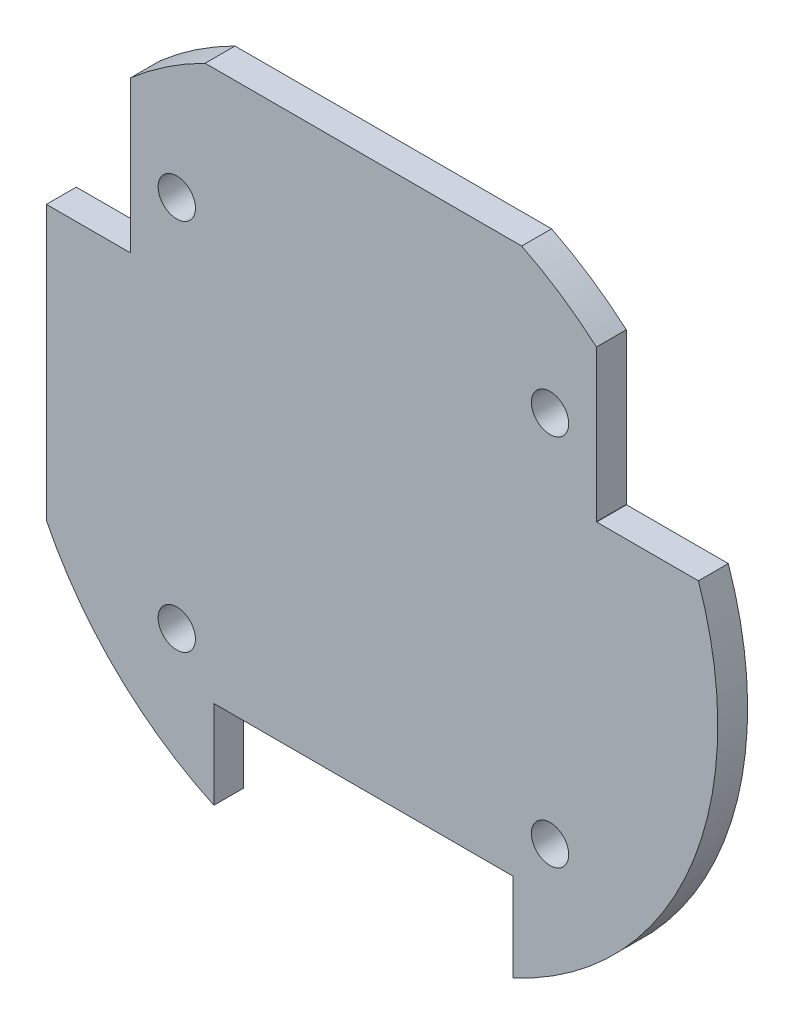
ISO-10303-21;
HEADER;
FILE_DESCRIPTION(('STEP AP214'),'2;1');
FILE_NAME('part.step','',(''),(''),'','','');
FILE_SCHEMA(('AUTOMOTIVE_DESIGN { 1 0 10303 214 1 1 1 1 }'));
ENDSEC;
DATA;
#1=APPLICATION_CONTEXT('core data for automotive mechanical design processes');
#2=APPLICATION_PROTOCOL_DEFINITION('international standard','automotive_design',2000,#1);
#3=PRODUCT_CONTEXT('',#1,'mechanical');
#4=PRODUCT('Part','Part','',(#3));
#5=PRODUCT_RELATED_PRODUCT_CATEGORY('part','',(#4));
#6=PRODUCT_DEFINITION_FORMATION('','',#4);
#7=PRODUCT_DEFINITION_CONTEXT('part definition',#1,'design');
#8=PRODUCT_DEFINITION('design','',#6,#7);
#9=PRODUCT_DEFINITION_SHAPE('','',#8);
#10=(LENGTH_UNIT() NAMED_UNIT(*) SI_UNIT(.MILLI.,.METRE.));
#11=(NAMED_UNIT(*) PLANE_ANGLE_UNIT() SI_UNIT($,.RADIAN.));
#12=(NAMED_UNIT(*) SI_UNIT($,.STERADIAN.) SOLID_ANGLE_UNIT());
#13=UNCERTAINTY_MEASURE_WITH_UNIT(LENGTH_MEASURE(1.E-05),#10,'distance_accuracy_value','');
#14=(GEOMETRIC_REPRESENTATION_CONTEXT(3) GLOBAL_UNCERTAINTY_ASSIGNED_CONTEXT((#13)) GLOBAL_UNIT_ASSIGNED_CONTEXT((#10,
#11,#12)) REPRESENTATION_CONTEXT('',''));
#15=CARTESIAN_POINT('',(0.,0.,0.));
#16=DIRECTION('',(0.,0.,1.));
#17=DIRECTION('',(1.,0.,0.));
#18=AXIS2_PLACEMENT_3D('',#15,#16,#17);
#19=CARTESIAN_POINT('',(4.48506477013,-0.05605791211582,0.));
#20=DIRECTION('',(0.,0.,-1.));
#21=DIRECTION('',(0.,-1.,0.));
#22=AXIS2_PLACEMENT_3D('',#19,#20,#21);
#23=CYLINDRICAL_SURFACE('',#22,0.01270002540005);
#24=DIRECTION('',(0.,0.,1.));
#25=VECTOR('',#24,1.);
#26=CARTESIAN_POINT('',(4.49776479553,-0.05605791211582,0.));
#27=LINE('',#26,#25);
#28=CARTESIAN_POINT('',(4.49776479553,-0.05605791211582,-1.51));
#29=VERTEX_POINT('',#28);
#30=CARTESIAN_POINT('',(4.49776479553,-0.05605791211582,0.09004318008636));
#31=VERTEX_POINT('',#30);
#32=EDGE_CURVE('E322',#29,#31,#27,.T.);
#33=ORIENTED_EDGE('',*,*,#32,.F.);
#34=CARTESIAN_POINT('',(4.48506477013,-0.05605791211582,-1.51));
#35=DIRECTION('',(0.,0.,1.));
#36=DIRECTION('',(0.,-1.,0.));
#37=AXIS2_PLACEMENT_3D('',#34,#35,#36);
#38=CIRCLE('',#37,0.01270002540005);
#39=CARTESIAN_POINT('',(4.48506477013,-0.06875793751587,-1.51));
#40=VERTEX_POINT('',#39);
#41=EDGE_CURVE('E231',#40,#29,#38,.T.);
#42=ORIENTED_EDGE('',*,*,#41,.F.);
#43=DIRECTION('',(0.,0.,1.));
#44=VECTOR('',#43,1.);
#45=CARTESIAN_POINT('',(4.48506477013,-0.06875793751587,0.));
#46=LINE('',#45,#44);
#47=CARTESIAN_POINT('',(4.48506477013,-0.06875793751587,0.09004318008636));
#48=VERTEX_POINT('',#47);
#49=EDGE_CURVE('E328',#40,#48,#46,.T.);
#50=ORIENTED_EDGE('',*,*,#49,.T.);
#51=CARTESIAN_POINT('',(4.48506477013,-0.05605791211582,0.09004318008636));
#52=DIRECTION('',(0.,0.,1.));
#53=DIRECTION('',(0.,-1.,0.));
#54=AXIS2_PLACEMENT_3D('',#51,#52,#53);
#55=CIRCLE('',#54,0.01270002540005);
#56=EDGE_CURVE('E324',#48,#31,#55,.T.);
#57=ORIENTED_EDGE('',*,*,#56,.T.);
#58=EDGE_LOOP('',(#33,#42,#50,#57));
#59=FACE_BOUND('',#58,.T.);
#60=ADVANCED_FACE('F62',(#59),#23,.F.);
#61=CARTESIAN_POINT('',(-0.002311404622809,-0.06875793751587,0.));
#62=DIRECTION('',(0.,1.,0.));
#63=DIRECTION('',(1.,0.,0.));
#64=AXIS2_PLACEMENT_3D('',#61,#62,#63);
#65=PLANE('',#64);
#66=ORIENTED_EDGE('',*,*,#49,.F.);
#67=DIRECTION('',(1.,0.,0.));
#68=VECTOR('',#67,1.);
#69=CARTESIAN_POINT('',(-0.002311404622809,-0.06875793751587,-1.51));
#70=LINE('',#69,#68);
#71=CARTESIAN_POINT('',(-0.002311404622809,-0.06875793751587,-1.51));
#72=VERTEX_POINT('',#71);
#73=EDGE_CURVE('E260',#72,#40,#70,.T.);
#74=ORIENTED_EDGE('',*,*,#73,.F.);
#75=DIRECTION('',(0.,0.,1.));
#76=VECTOR('',#75,1.);
#77=CARTESIAN_POINT('',(-0.002311404622809,-0.06875793751587,0.));
#78=LINE('',#77,#76);
#79=CARTESIAN_POINT('',(-0.002311404622809,-0.06875793751587,0.09004318008636));
#80=VERTEX_POINT('',#79);
#81=EDGE_CURVE('E333',#72,#80,#78,.T.);
#82=ORIENTED_EDGE('',*,*,#81,.T.);
#83=DIRECTION('',(1.,0.,0.));
#84=VECTOR('',#83,1.);
#85=CARTESIAN_POINT('',(-0.002311404622809,-0.06875793751587,0.09004318008636));
#86=LINE('',#85,#84);
#87=EDGE_CURVE('E399',#80,#48,#86,.T.);
#88=ORIENTED_EDGE('',*,*,#87,.T.);
#89=EDGE_LOOP('',(#66,#74,#82,#88));
#90=FACE_BOUND('',#89,.T.);
#91=ADVANCED_FACE('F743',(#90),#65,.T.);
#92=CARTESIAN_POINT('',(-0.00231140462283,-14.73828105161,0.));
#93=DIRECTION('',(-1.,0.,0.));
#94=DIRECTION('',(0.,0.,1.));
#95=AXIS2_PLACEMENT_3D('',#92,#93,#94);
#96=PLANE('',#95);
#97=ORIENTED_EDGE('',*,*,#81,.F.);
#98=DIRECTION('',(0.,1.,0.));
#99=VECTOR('',#98,1.);
#100=CARTESIAN_POINT('',(-0.00231140462283,-14.73828105161,-1.51));
#101=LINE('',#100,#99);
#102=CARTESIAN_POINT('',(-0.002311404622832,-14.73828105161,-1.51));
#103=VERTEX_POINT('',#102);
#104=EDGE_CURVE('E251',#103,#72,#101,.T.);
#105=ORIENTED_EDGE('',*,*,#104,.F.);
#106=DIRECTION('',(0.,0.,1.));
#107=VECTOR('',#106,1.);
#108=CARTESIAN_POINT('',(-0.002311404622832,-14.73828105161,0.));
#109=LINE('',#108,#107);
#110=CARTESIAN_POINT('',(-0.002311404622832,-14.73828105161,0.09004318008636));
#111=VERTEX_POINT('',#110);
#112=EDGE_CURVE('E331',#103,#111,#109,.T.);
#113=ORIENTED_EDGE('',*,*,#112,.T.);
#114=DIRECTION('',(0.,1.,0.));
#115=VECTOR('',#114,1.);
#116=CARTESIAN_POINT('',(-0.00231140462283,-14.73828105161,0.09004318008636));
#117=LINE('',#116,#115);
#118=EDGE_CURVE('E329',#111,#80,#117,.T.);
#119=ORIENTED_EDGE('',*,*,#118,.T.);
#120=EDGE_LOOP('',(#97,#105,#113,#119));
#121=FACE_BOUND('',#120,.T.);
#122=ADVANCED_FACE('F727',(#121),#96,.T.);
#123=CARTESIAN_POINT('',(16.985001321992,-6.256019168509,0.));
#124=DIRECTION('',(0.,0.,-1.));
#125=DIRECTION('',(-0.422002464177845,-0.906594683542666,0.));
#126=AXIS2_PLACEMENT_3D('',#123,#124,#125);
#127=CYLINDRICAL_SURFACE('',#126,18.9872999746);
#128=ORIENTED_EDGE('',*,*,#112,.F.);
#129=CARTESIAN_POINT('',(16.985001321992,-6.256019168509,-1.51));
#130=DIRECTION('',(0.,0.,-1.));
#131=DIRECTION('',(-0.422002464177845,-0.906594683542666,0.));
#132=AXIS2_PLACEMENT_3D('',#129,#130,#131);
#133=CIRCLE('',#132,18.9872999746);
#134=CARTESIAN_POINT('',(8.972313944628,-23.46980438031,-1.51));
#135=VERTEX_POINT('',#134);
#136=EDGE_CURVE('E256',#135,#103,#133,.T.);
#137=ORIENTED_EDGE('',*,*,#136,.F.);
#138=DIRECTION('',(0.,0.,1.));
#139=VECTOR('',#138,1.);
#140=CARTESIAN_POINT('',(8.972313944628,-23.46980438031,0.));
#141=LINE('',#140,#139);
#142=CARTESIAN_POINT('',(8.972313944628,-23.46980438031,0.09004318008636));
#143=VERTEX_POINT('',#142);
#144=EDGE_CURVE('E338',#135,#143,#141,.T.);
#145=ORIENTED_EDGE('',*,*,#144,.T.);
#146=CARTESIAN_POINT('',(16.985001321992,-6.256019168509,0.09004318008636));
#147=DIRECTION('',(0.,0.,-1.));
#148=DIRECTION('',(-0.422002464177845,-0.906594683542666,0.));
#149=AXIS2_PLACEMENT_3D('',#146,#147,#148);
#150=CIRCLE('',#149,18.9872999746);
#151=EDGE_CURVE('E337',#143,#111,#150,.T.);
#152=ORIENTED_EDGE('',*,*,#151,.T.);
#153=EDGE_LOOP('',(#128,#137,#145,#152));
#154=FACE_BOUND('',#153,.T.);
#155=ADVANCED_FACE('F720',(#154),#127,.T.);
#156=CARTESIAN_POINT('',(8.972313944628,-18.75603251206,0.));
#157=DIRECTION('',(1.,0.,0.));
#158=DIRECTION('',(0.,-1.,0.));
#159=AXIS2_PLACEMENT_3D('',#156,#157,#158);
#160=PLANE('',#159);
#161=ORIENTED_EDGE('',*,*,#144,.F.);
#162=DIRECTION('',(0.,-1.,0.));
#163=VECTOR('',#162,1.);
#164=CARTESIAN_POINT('',(8.972313944628,-18.75603251206,-1.51));
#165=LINE('',#164,#163);
#166=CARTESIAN_POINT('',(8.972313944628,-18.75603251206,-1.51));
#167=VERTEX_POINT('',#166);
#168=EDGE_CURVE('E286',#167,#135,#165,.T.);
#169=ORIENTED_EDGE('',*,*,#168,.F.);
#170=DIRECTION('',(0.,0.,1.));
#171=VECTOR('',#170,1.);
#172=CARTESIAN_POINT('',(8.972313944628,-18.75603251206,0.));
#173=LINE('',#172,#171);
#174=CARTESIAN_POINT('',(8.972313944628,-18.75603251206,0.09004318008636));
#175=VERTEX_POINT('',#174);
#176=EDGE_CURVE('E344',#167,#175,#173,.T.);
#177=ORIENTED_EDGE('',*,*,#176,.T.);
#178=DIRECTION('',(0.,-1.,0.));
#179=VECTOR('',#178,1.);
#180=CARTESIAN_POINT('',(8.972313944628,-18.75603251206,0.09004318008636));
#181=LINE('',#180,#179);
#182=EDGE_CURVE('E343',#175,#143,#181,.T.);
#183=ORIENTED_EDGE('',*,*,#182,.T.);
#184=EDGE_LOOP('',(#161,#169,#177,#183));
#185=FACE_BOUND('',#184,.T.);
#186=ADVANCED_FACE('F704',(#185),#160,.T.);
#187=CARTESIAN_POINT('',(8.985013970028,-18.75603251206,0.));
#188=DIRECTION('',(0.,0.,-1.));
#189=DIRECTION('',(0.,1.,0.));
#190=AXIS2_PLACEMENT_3D('',#187,#188,#189);
#191=CYLINDRICAL_SURFACE('',#190,0.01270002540005);
#192=ORIENTED_EDGE('',*,*,#176,.F.);
#193=CARTESIAN_POINT('',(8.985013970028,-18.75603251206,-1.51));
#194=DIRECTION('',(0.,0.,1.));
#195=DIRECTION('',(0.,1.,0.));
#196=AXIS2_PLACEMENT_3D('',#193,#194,#195);
#197=CIRCLE('',#196,0.01270002540005);
#198=CARTESIAN_POINT('',(8.985013970028,-18.74333248666,-1.51));
#199=VERTEX_POINT('',#198);
#200=EDGE_CURVE('E281',#199,#167,#197,.T.);
#201=ORIENTED_EDGE('',*,*,#200,.F.);
#202=DIRECTION('',(0.,0.,1.));
#203=VECTOR('',#202,1.);
#204=CARTESIAN_POINT('',(8.985013970028,-18.74333248666,0.));
#205=LINE('',#204,#203);
#206=CARTESIAN_POINT('',(8.985013970028,-18.74333248666,0.09004318008636));
#207=VERTEX_POINT('',#206);
#208=EDGE_CURVE('E348',#199,#207,#205,.T.);
#209=ORIENTED_EDGE('',*,*,#208,.T.);
#210=CARTESIAN_POINT('',(8.985013970028,-18.75603251206,0.09004318008636));
#211=DIRECTION('',(0.,0.,1.));
#212=DIRECTION('',(0.,1.,0.));
#213=AXIS2_PLACEMENT_3D('',#210,#211,#212);
#214=CIRCLE('',#213,0.01270002540005);
#215=EDGE_CURVE('E347',#207,#175,#214,.T.);
#216=ORIENTED_EDGE('',*,*,#215,.T.);
#217=EDGE_LOOP('',(#192,#201,#209,#216));
#218=FACE_BOUND('',#217,.T.);
#219=ADVANCED_FACE('F691',(#218),#191,.F.);
#220=CARTESIAN_POINT('',(24.98506477013,-18.74333248666,0.));
#221=DIRECTION('',(0.,-1.,0.));
#222=DIRECTION('',(0.,0.,-1.));
#223=AXIS2_PLACEMENT_3D('',#220,#221,#222);
#224=PLANE('',#223);
#225=ORIENTED_EDGE('',*,*,#208,.F.);
#226=DIRECTION('',(-1.,0.,0.));
#227=VECTOR('',#226,1.);
#228=CARTESIAN_POINT('',(24.98506477013,-18.74333248666,-1.51));
#229=LINE('',#228,#227);
#230=CARTESIAN_POINT('',(24.98506477013,-18.74333248666,-1.51));
#231=VERTEX_POINT('',#230);
#232=EDGE_CURVE('E278',#231,#199,#229,.T.);
#233=ORIENTED_EDGE('',*,*,#232,.F.);
#234=DIRECTION('',(0.,0.,1.));
#235=VECTOR('',#234,1.);
#236=CARTESIAN_POINT('',(24.98506477013,-18.74333248666,0.));
#237=LINE('',#236,#235);
#238=CARTESIAN_POINT('',(24.98506477013,-18.74333248666,0.09004318008636));
#239=VERTEX_POINT('',#238);
#240=EDGE_CURVE('E358',#231,#239,#237,.T.);
#241=ORIENTED_EDGE('',*,*,#240,.T.);
#242=DIRECTION('',(-1.,0.,0.));
#243=VECTOR('',#242,1.);
#244=CARTESIAN_POINT('',(24.98506477013,-18.74333248666,0.09004318008636));
#245=LINE('',#244,#243);
#246=EDGE_CURVE('E362',#239,#207,#245,.T.);
#247=ORIENTED_EDGE('',*,*,#246,.T.);
#248=EDGE_LOOP('',(#225,#233,#241,#247));
#249=FACE_BOUND('',#248,.T.);
#250=ADVANCED_FACE('F682',(#249),#224,.T.);
#251=CARTESIAN_POINT('',(24.98506477013,-18.75603251206,0.));
#252=DIRECTION('',(0.,0.,-1.));
#253=DIRECTION('',(1.,0.,0.));
#254=AXIS2_PLACEMENT_3D('',#251,#252,#253);
#255=CYLINDRICAL_SURFACE('',#254,0.01270002540005);
#256=ORIENTED_EDGE('',*,*,#240,.F.);
#257=CARTESIAN_POINT('',(24.98506477013,-18.75603251206,-1.51));
#258=DIRECTION('',(0.,0.,1.));
#259=DIRECTION('',(1.,0.,0.));
#260=AXIS2_PLACEMENT_3D('',#257,#258,#259);
#261=CIRCLE('',#260,0.01270002540005);
#262=CARTESIAN_POINT('',(24.99776479553,-18.75603251206,-1.51));
#263=VERTEX_POINT('',#262);
#264=EDGE_CURVE('E277',#263,#231,#261,.T.);
#265=ORIENTED_EDGE('',*,*,#264,.F.);
#266=DIRECTION('',(0.,0.,1.));
#267=VECTOR('',#266,1.);
#268=CARTESIAN_POINT('',(24.99776479553,-18.75603251206,0.));
#269=LINE('',#268,#267);
#270=CARTESIAN_POINT('',(24.99776479553,-18.75603251206,0.09004318008636));
#271=VERTEX_POINT('',#270);
#272=EDGE_CURVE('E353',#263,#271,#269,.T.);
#273=ORIENTED_EDGE('',*,*,#272,.T.);
#274=CARTESIAN_POINT('',(24.98506477013,-18.75603251206,0.09004318008636));
#275=DIRECTION('',(0.,0.,1.));
#276=DIRECTION('',(1.,0.,0.));
#277=AXIS2_PLACEMENT_3D('',#274,#275,#276);
#278=CIRCLE('',#277,0.01270002540005);
#279=EDGE_CURVE('E352',#271,#239,#278,.T.);
#280=ORIENTED_EDGE('',*,*,#279,.T.);
#281=EDGE_LOOP('',(#256,#265,#273,#280));
#282=FACE_BOUND('',#281,.T.);
#283=ADVANCED_FACE('F666',(#282),#255,.F.);
#284=CARTESIAN_POINT('',(24.99776479553,-23.46978070224,0.));
#285=DIRECTION('',(-1.,0.,0.));
#286=DIRECTION('',(0.,0.,1.));
#287=AXIS2_PLACEMENT_3D('',#284,#285,#286);
#288=PLANE('',#287);
#289=ORIENTED_EDGE('',*,*,#272,.F.);
#290=DIRECTION('',(0.,1.,0.));
#291=VECTOR('',#290,1.);
#292=CARTESIAN_POINT('',(24.99776479553,-23.46978070224,-1.51));
#293=LINE('',#292,#291);
#294=CARTESIAN_POINT('',(24.99776479553,-23.46978070224,-1.51));
#295=VERTEX_POINT('',#294);
#296=EDGE_CURVE('E275',#295,#263,#293,.T.);
#297=ORIENTED_EDGE('',*,*,#296,.F.);
#298=DIRECTION('',(0.,0.,1.));
#299=VECTOR('',#298,1.);
#300=CARTESIAN_POINT('',(24.99776479553,-23.46978070224,0.));
#301=LINE('',#300,#299);
#302=CARTESIAN_POINT('',(24.99776479553,-23.46978070224,0.09004318008636));
#303=VERTEX_POINT('',#302);
#304=EDGE_CURVE('E363',#295,#303,#301,.T.);
#305=ORIENTED_EDGE('',*,*,#304,.T.);
#306=DIRECTION('',(0.,1.,0.));
#307=VECTOR('',#306,1.);
#308=CARTESIAN_POINT('',(24.99776479553,-23.46978070224,0.09004318008636));
#309=LINE('',#308,#307);
#310=EDGE_CURVE('E360',#303,#271,#309,.T.);
#311=ORIENTED_EDGE('',*,*,#310,.T.);
#312=EDGE_LOOP('',(#289,#297,#305,#311));
#313=FACE_BOUND('',#312,.T.);
#314=ADVANCED_FACE('F660',(#313),#288,.T.);
#315=CARTESIAN_POINT('',(16.985001975941,-6.256030607557,0.));
#316=DIRECTION('',(0.,0.,-1.));
#317=DIRECTION('',(0.945416744054724,0.325863744624905,0.));
#318=AXIS2_PLACEMENT_3D('',#315,#316,#317);
#319=CYLINDRICAL_SURFACE('',#318,18.9872999746);
#320=ORIENTED_EDGE('',*,*,#304,.F.);
#321=CARTESIAN_POINT('',(16.985001975941,-6.256030607557,-1.51));
#322=DIRECTION('',(0.,0.,-1.));
#323=DIRECTION('',(0.945416744054724,0.325863744624905,0.));
#324=AXIS2_PLACEMENT_3D('',#321,#322,#323);
#325=CIRCLE('',#324,18.9872999746);
#326=CARTESIAN_POINT('',(34.935913296318,-0.06875793751587,-1.51));
#327=VERTEX_POINT('',#326);
#328=EDGE_CURVE('E268',#327,#295,#325,.T.);
#329=ORIENTED_EDGE('',*,*,#328,.F.);
#330=DIRECTION('',(0.,0.,1.));
#331=VECTOR('',#330,1.);
#332=CARTESIAN_POINT('',(34.935913296318,-0.06875793751587,0.));
#333=LINE('',#332,#331);
#334=CARTESIAN_POINT('',(34.935913296318,-0.06875793751587,0.09004318008636));
#335=VERTEX_POINT('',#334);
#336=EDGE_CURVE('E373',#327,#335,#333,.T.);
#337=ORIENTED_EDGE('',*,*,#336,.T.);
#338=CARTESIAN_POINT('',(16.985001975941,-6.256030607557,0.09004318008636));
#339=DIRECTION('',(0.,0.,-1.));
#340=DIRECTION('',(0.945416744054724,0.325863744624905,0.));
#341=AXIS2_PLACEMENT_3D('',#338,#339,#340);
#342=CIRCLE('',#341,18.9872999746);
#343=EDGE_CURVE('E369',#335,#303,#342,.T.);
#344=ORIENTED_EDGE('',*,*,#343,.T.);
#345=EDGE_LOOP('',(#320,#329,#337,#344));
#346=FACE_BOUND('',#345,.T.);
#347=ADVANCED_FACE('F642',(#346),#319,.T.);
#348=CARTESIAN_POINT('',(29.485013970028,-0.06875793751587,0.));
#349=DIRECTION('',(0.,1.,0.));
#350=DIRECTION('',(1.,0.,0.));
#351=AXIS2_PLACEMENT_3D('',#348,#349,#350);
#352=PLANE('',#351);
#353=ORIENTED_EDGE('',*,*,#336,.F.);
#354=DIRECTION('',(1.,0.,0.));
#355=VECTOR('',#354,1.);
#356=CARTESIAN_POINT('',(29.485013970028,-0.06875793751587,-1.51));
#357=LINE('',#356,#355);
#358=CARTESIAN_POINT('',(29.485013970028,-0.06875793751587,-1.51));
#359=VERTEX_POINT('',#358);
#360=EDGE_CURVE('E262',#359,#327,#357,.T.);
#361=ORIENTED_EDGE('',*,*,#360,.F.);
#362=DIRECTION('',(0.,0.,1.));
#363=VECTOR('',#362,1.);
#364=CARTESIAN_POINT('',(29.485013970028,-0.06875793751587,0.));
#365=LINE('',#364,#363);
#366=CARTESIAN_POINT('',(29.485013970028,-0.06875793751587,0.09004318008636));
#367=VERTEX_POINT('',#366);
#368=EDGE_CURVE('E381',#359,#367,#365,.T.);
#369=ORIENTED_EDGE('',*,*,#368,.T.);
#370=DIRECTION('',(1.,0.,0.));
#371=VECTOR('',#370,1.);
#372=CARTESIAN_POINT('',(29.485013970028,-0.06875793751587,0.09004318008636));
#373=LINE('',#372,#371);
#374=EDGE_CURVE('E380',#367,#335,#373,.T.);
#375=ORIENTED_EDGE('',*,*,#374,.T.);
#376=EDGE_LOOP('',(#353,#361,#369,#375));
#377=FACE_BOUND('',#376,.T.);
#378=ADVANCED_FACE('F631',(#377),#352,.T.);
#379=CARTESIAN_POINT('',(29.485013970028,-0.05605791211582,0.));
#380=DIRECTION('',(0.,0.,-1.));
#381=DIRECTION('',(-1.,0.,0.));
#382=AXIS2_PLACEMENT_3D('',#379,#380,#381);
#383=CYLINDRICAL_SURFACE('',#382,0.01270002540005);
#384=ORIENTED_EDGE('',*,*,#368,.F.);
#385=CARTESIAN_POINT('',(29.485013970028,-0.05605791211582,-1.51));
#386=DIRECTION('',(0.,0.,1.));
#387=DIRECTION('',(-1.,0.,0.));
#388=AXIS2_PLACEMENT_3D('',#385,#386,#387);
#389=CIRCLE('',#388,0.01270002540005);
#390=CARTESIAN_POINT('',(29.472313944628,-0.05605791211582,-1.51));
#391=VERTEX_POINT('',#390);
#392=EDGE_CURVE('E247',#391,#359,#389,.T.);
#393=ORIENTED_EDGE('',*,*,#392,.F.);
#394=DIRECTION('',(0.,0.,1.));
#395=VECTOR('',#394,1.);
#396=CARTESIAN_POINT('',(29.472313944628,-0.05605791211582,0.));
#397=LINE('',#396,#395);
#398=CARTESIAN_POINT('',(29.472313944628,-0.05605791211582,0.09004318008636));
#399=VERTEX_POINT('',#398);
#400=EDGE_CURVE('E387',#391,#399,#397,.T.);
#401=ORIENTED_EDGE('',*,*,#400,.T.);
#402=CARTESIAN_POINT('',(29.485013970028,-0.05605791211582,0.09004318008636));
#403=DIRECTION('',(0.,0.,1.));
#404=DIRECTION('',(-1.,0.,0.));
#405=AXIS2_PLACEMENT_3D('',#402,#403,#404);
#406=CIRCLE('',#405,0.01270002540005);
#407=EDGE_CURVE('E385',#399,#367,#406,.T.);
#408=ORIENTED_EDGE('',*,*,#407,.T.);
#409=EDGE_LOOP('',(#384,#393,#401,#408));
#410=FACE_BOUND('',#409,.T.);
#411=ADVANCED_FACE('F622',(#410),#383,.F.);
#412=CARTESIAN_POINT('',(29.472313944628,8.047290471386,0.));
#413=DIRECTION('',(1.,0.,0.));
#414=DIRECTION('',(0.,-1.,0.));
#415=AXIS2_PLACEMENT_3D('',#412,#413,#414);
#416=PLANE('',#415);
#417=ORIENTED_EDGE('',*,*,#400,.F.);
#418=DIRECTION('',(0.,-1.,0.));
#419=VECTOR('',#418,1.);
#420=CARTESIAN_POINT('',(29.472313944628,8.047290471386,-1.51));
#421=LINE('',#420,#419);
#422=CARTESIAN_POINT('',(29.472313944628,8.047290471386,-1.51));
#423=VERTEX_POINT('',#422);
#424=EDGE_CURVE('E243',#423,#391,#421,.T.);
#425=ORIENTED_EDGE('',*,*,#424,.F.);
#426=DIRECTION('',(0.,0.,1.));
#427=VECTOR('',#426,1.);
#428=CARTESIAN_POINT('',(29.472313944628,8.047290471386,0.));
#429=LINE('',#428,#427);
#430=CARTESIAN_POINT('',(29.472313944628,8.047290471386,0.09004318008636));
#431=VERTEX_POINT('',#430);
#432=EDGE_CURVE('E392',#423,#431,#429,.T.);
#433=ORIENTED_EDGE('',*,*,#432,.T.);
#434=DIRECTION('',(0.,-1.,0.));
#435=VECTOR('',#434,1.);
#436=CARTESIAN_POINT('',(29.472313944628,8.047290471386,0.09004318008636));
#437=LINE('',#436,#435);
#438=EDGE_CURVE('E390',#431,#399,#437,.T.);
#439=ORIENTED_EDGE('',*,*,#438,.T.);
#440=EDGE_LOOP('',(#417,#425,#433,#439));
#441=FACE_BOUND('',#440,.T.);
#442=ADVANCED_FACE('F606',(#441),#416,.T.);
#443=CARTESIAN_POINT('',(16.985011857888,-6.256025470029,0.));
#444=DIRECTION('',(0.,0.,-1.));
#445=DIRECTION('',(0.446732851295104,0.894667401649209,0.));
#446=AXIS2_PLACEMENT_3D('',#443,#444,#445);
#447=CYLINDRICAL_SURFACE('',#446,18.9872999746);
#448=ORIENTED_EDGE('',*,*,#432,.F.);
#449=CARTESIAN_POINT('',(16.985011857888,-6.256025470029,-1.51));
#450=DIRECTION('',(0.,0.,-1.));
#451=DIRECTION('',(0.446732851295104,0.894667401649209,0.));
#452=AXIS2_PLACEMENT_3D('',#449,#450,#451);
#453=CIRCLE('',#452,18.9872999746);
#454=CARTESIAN_POINT('',(25.467262513926,10.731292862586,-1.51));
#455=VERTEX_POINT('',#454);
#456=EDGE_CURVE('E245',#455,#423,#453,.T.);
#457=ORIENTED_EDGE('',*,*,#456,.F.);
#458=DIRECTION('',(0.,0.,1.));
#459=VECTOR('',#458,1.);
#460=CARTESIAN_POINT('',(25.467262513926,10.731292862586,0.));
#461=LINE('',#460,#459);
#462=CARTESIAN_POINT('',(25.467262513926,10.731292862586,0.09004318008636));
#463=VERTEX_POINT('',#462);
#464=EDGE_CURVE('E398',#455,#463,#461,.T.);
#465=ORIENTED_EDGE('',*,*,#464,.T.);
#466=CARTESIAN_POINT('',(16.985011857888,-6.256025470029,0.09004318008636));
#467=DIRECTION('',(0.,0.,-1.));
#468=DIRECTION('',(0.446732851295104,0.894667401649209,0.));
#469=AXIS2_PLACEMENT_3D('',#466,#467,#468);
#470=CIRCLE('',#469,18.9872999746);
#471=EDGE_CURVE('E395',#463,#431,#470,.T.);
#472=ORIENTED_EDGE('',*,*,#471,.T.);
#473=EDGE_LOOP('',(#448,#457,#465,#472));
#474=FACE_BOUND('',#473,.T.);
#475=ADVANCED_FACE('F597',(#474),#447,.T.);
#476=CARTESIAN_POINT('',(17.240102099781,-6.568149206178,0.09004318008636));
#477=DIRECTION('',(0.,0.,-1.));
#478=DIRECTION('',(0.,-1.,0.));
#479=AXIS2_PLACEMENT_3D('',#476,#477,#478);
#480=PLANE('',#479);
#481=CARTESIAN_POINT('',(26.985013970028,3.743967487935,0.09004318008636));
#482=DIRECTION('',(0.,0.,1.));
#483=DIRECTION('',(1.,0.,0.));
#484=AXIS2_PLACEMENT_3D('',#481,#482,#483);
#485=CIRCLE('',#484,1.);
#486=CARTESIAN_POINT('',(27.985013970028,3.743967487935,0.09004318008636));
#487=VERTEX_POINT('',#486);
#488=EDGE_CURVE('E315',#487,#487,#485,.T.);
#489=ORIENTED_EDGE('',*,*,#488,.F.);
#490=EDGE_LOOP('',(#489));
#491=FACE_BOUND('',#490,.T.);
#492=CARTESIAN_POINT('',(26.985013970028,-16.25603251206,0.09004318008636));
#493=DIRECTION('',(0.,0.,1.));
#494=DIRECTION('',(1.,0.,0.));
#495=AXIS2_PLACEMENT_3D('',#492,#493,#494);
#496=CIRCLE('',#495,1.);
#497=CARTESIAN_POINT('',(27.985013970028,-16.25603251206,0.09004318008636));
#498=VERTEX_POINT('',#497);
#499=EDGE_CURVE('E316',#498,#498,#496,.T.);
#500=ORIENTED_EDGE('',*,*,#499,.F.);
#501=EDGE_LOOP('',(#500));
#502=FACE_BOUND('',#501,.T.);
#503=CARTESIAN_POINT('',(6.985013970028,3.743967487935,0.09004318008636));
#504=DIRECTION('',(0.,0.,1.));
#505=DIRECTION('',(1.,0.,0.));
#506=AXIS2_PLACEMENT_3D('',#503,#504,#505);
#507=CIRCLE('',#506,1.);
#508=CARTESIAN_POINT('',(7.985013970028,3.743967487935,0.09004318008636));
#509=VERTEX_POINT('',#508);
#510=EDGE_CURVE('E320',#509,#509,#507,.T.);
#511=ORIENTED_EDGE('',*,*,#510,.F.);
#512=EDGE_LOOP('',(#511));
#513=FACE_BOUND('',#512,.T.);
#514=CARTESIAN_POINT('',(6.985013970028,-16.25603251206,0.09004318008636));
#515=DIRECTION('',(0.,0.,1.));
#516=DIRECTION('',(1.,0.,0.));
#517=AXIS2_PLACEMENT_3D('',#514,#515,#516);
#518=CIRCLE('',#517,1.);
#519=CARTESIAN_POINT('',(7.985013970028,-16.25603251206,0.09004318008636));
#520=VERTEX_POINT('',#519);
#521=EDGE_CURVE('E321',#520,#520,#518,.T.);
#522=ORIENTED_EDGE('',*,*,#521,.F.);
#523=EDGE_LOOP('',(#522));
#524=FACE_BOUND('',#523,.T.);
#525=DIRECTION('',(0.,1.,0.));
#526=VECTOR('',#525,1.);
#527=CARTESIAN_POINT('',(4.49776479553,-0.05605791211582,0.09004318008636));
#528=LINE('',#527,#526);
#529=CARTESIAN_POINT('',(4.49776479553,8.047334821518,0.09004318008636));
#530=VERTEX_POINT('',#529);
#531=EDGE_CURVE('E221',#31,#530,#528,.T.);
#532=ORIENTED_EDGE('',*,*,#531,.F.);
#533=ORIENTED_EDGE('',*,*,#56,.F.);
#534=ORIENTED_EDGE('',*,*,#87,.F.);
#535=ORIENTED_EDGE('',*,*,#118,.F.);
#536=ORIENTED_EDGE('',*,*,#151,.F.);
#537=ORIENTED_EDGE('',*,*,#182,.F.);
#538=ORIENTED_EDGE('',*,*,#215,.F.);
#539=ORIENTED_EDGE('',*,*,#246,.F.);
#540=ORIENTED_EDGE('',*,*,#279,.F.);
#541=ORIENTED_EDGE('',*,*,#310,.F.);
#542=ORIENTED_EDGE('',*,*,#343,.F.);
#543=ORIENTED_EDGE('',*,*,#374,.F.);
#544=ORIENTED_EDGE('',*,*,#407,.F.);
#545=ORIENTED_EDGE('',*,*,#438,.F.);
#546=ORIENTED_EDGE('',*,*,#471,.F.);
#547=DIRECTION('',(1.,0.,0.));
#548=VECTOR('',#547,1.);
#549=CARTESIAN_POINT('',(8.50276542613,10.731292862586,0.09004318008636));
#550=LINE('',#549,#548);
#551=CARTESIAN_POINT('',(8.50276542613,10.731292862586,0.09004318008636));
#552=VERTEX_POINT('',#551);
#553=EDGE_CURVE('E400',#552,#463,#550,.T.);
#554=ORIENTED_EDGE('',*,*,#553,.F.);
#555=CARTESIAN_POINT('',(16.985016082168,-6.256025470028,0.09004318008636));
#556=DIRECTION('',(0.,0.,-1.));
#557=DIRECTION('',(-0.657663348835277,0.753311966982318,0.));
#558=AXIS2_PLACEMENT_3D('',#555,#556,#557);
#559=CIRCLE('',#558,18.9872999746);
#560=EDGE_CURVE('E69',#530,#552,#559,.T.);
#561=ORIENTED_EDGE('',*,*,#560,.F.);
#562=EDGE_LOOP('',(#532,#533,#534,#535,#536,#537,#538,#539,#540,#541,#542,#543,#544,#545,#546,
#554,#561));
#563=FACE_BOUND('',#562,.T.);
#564=ADVANCED_FACE('F586',(#491,#502,#513,#524,#563),#480,.F.);
#565=CARTESIAN_POINT('',(4.49776479553,-0.05605791211582,0.));
#566=DIRECTION('',(-1.,0.,0.));
#567=DIRECTION('',(0.,0.,1.));
#568=AXIS2_PLACEMENT_3D('',#565,#566,#567);
#569=PLANE('',#568);
#570=DIRECTION('',(0.,0.,1.));
#571=VECTOR('',#570,1.);
#572=CARTESIAN_POINT('',(4.49776479553,8.047334821518,0.));
#573=LINE('',#572,#571);
#574=CARTESIAN_POINT('',(4.49776479553,8.047334821518,-1.51));
#575=VERTEX_POINT('',#574);
#576=EDGE_CURVE('E11',#575,#530,#573,.T.);
#577=ORIENTED_EDGE('',*,*,#576,.F.);
#578=DIRECTION('',(0.,1.,0.));
#579=VECTOR('',#578,1.);
#580=CARTESIAN_POINT('',(4.49776479553,-0.05605791211582,-1.51));
#581=LINE('',#580,#579);
#582=EDGE_CURVE('E222',#29,#575,#581,.T.);
#583=ORIENTED_EDGE('',*,*,#582,.F.);
#584=ORIENTED_EDGE('',*,*,#32,.T.);
#585=ORIENTED_EDGE('',*,*,#531,.T.);
#586=EDGE_LOOP('',(#577,#583,#584,#585));
#587=FACE_BOUND('',#586,.T.);
#588=ADVANCED_FACE('F219',(#587),#569,.T.);
#589=CARTESIAN_POINT('',(8.50276542613,10.731292862586,0.));
#590=DIRECTION('',(0.,1.,0.));
#591=DIRECTION('',(1.,0.,0.));
#592=AXIS2_PLACEMENT_3D('',#589,#590,#591);
#593=PLANE('',#592);
#594=ORIENTED_EDGE('',*,*,#464,.F.);
#595=DIRECTION('',(1.,0.,0.));
#596=VECTOR('',#595,1.);
#597=CARTESIAN_POINT('',(8.50276542613,10.731292862586,-1.51));
#598=LINE('',#597,#596);
#599=CARTESIAN_POINT('',(8.50276542613,10.731292862586,-1.51));
#600=VERTEX_POINT('',#599);
#601=EDGE_CURVE('E240',#600,#455,#598,.T.);
#602=ORIENTED_EDGE('',*,*,#601,.F.);
#603=DIRECTION('',(0.,0.,1.));
#604=VECTOR('',#603,1.);
#605=CARTESIAN_POINT('',(8.50276542613,10.731292862586,0.));
#606=LINE('',#605,#604);
#607=EDGE_CURVE('E90',#600,#552,#606,.T.);
#608=ORIENTED_EDGE('',*,*,#607,.T.);
#609=ORIENTED_EDGE('',*,*,#553,.T.);
#610=EDGE_LOOP('',(#594,#602,#608,#609));
#611=FACE_BOUND('',#610,.T.);
#612=ADVANCED_FACE('F569',(#611),#593,.T.);
#613=CARTESIAN_POINT('',(16.985016082168,-6.256025470028,0.));
#614=DIRECTION('',(0.,0.,-1.));
#615=DIRECTION('',(-0.657663348835277,0.753311966982318,0.));
#616=AXIS2_PLACEMENT_3D('',#613,#614,#615);
#617=CYLINDRICAL_SURFACE('',#616,18.9872999746);
#618=ORIENTED_EDGE('',*,*,#607,.F.);
#619=CARTESIAN_POINT('',(16.985016082168,-6.256025470028,-1.51));
#620=DIRECTION('',(0.,0.,-1.));
#621=DIRECTION('',(-0.657663348835277,0.753311966982318,0.));
#622=AXIS2_PLACEMENT_3D('',#619,#620,#621);
#623=CIRCLE('',#622,18.9872999746);
#624=EDGE_CURVE('E228',#575,#600,#623,.T.);
#625=ORIENTED_EDGE('',*,*,#624,.F.);
#626=ORIENTED_EDGE('',*,*,#576,.T.);
#627=ORIENTED_EDGE('',*,*,#560,.T.);
#628=EDGE_LOOP('',(#618,#625,#626,#627));
#629=FACE_BOUND('',#628,.T.);
#630=ADVANCED_FACE('F64',(#629),#617,.T.);
#631=CARTESIAN_POINT('',(6.985013970028,-16.25603251206,0.));
#632=DIRECTION('',(0.,0.,-1.));
#633=DIRECTION('',(1.,0.,0.));
#634=AXIS2_PLACEMENT_3D('',#631,#632,#633);
#635=CYLINDRICAL_SURFACE('',#634,1.);
#636=ORIENTED_EDGE('',*,*,#521,.T.);
#637=EDGE_LOOP('',(#636));
#638=FACE_BOUND('',#637,.T.);
#639=CARTESIAN_POINT('',(6.985013970028,-16.25603251206,-1.51));
#640=DIRECTION('',(0.,0.,1.));
#641=DIRECTION('',(1.,0.,0.));
#642=AXIS2_PLACEMENT_3D('',#639,#640,#641);
#643=CIRCLE('',#642,1.);
#644=CARTESIAN_POINT('',(7.985013970028,-16.25603251206,-1.51));
#645=VERTEX_POINT('',#644);
#646=EDGE_CURVE('E232',#645,#645,#643,.T.);
#647=ORIENTED_EDGE('',*,*,#646,.F.);
#648=EDGE_LOOP('',(#647));
#649=FACE_BOUND('',#648,.T.);
#650=ADVANCED_FACE('F545',(#638,#649),#635,.F.);
#651=CARTESIAN_POINT('',(6.985013970028,3.743967487935,0.));
#652=DIRECTION('',(0.,0.,-1.));
#653=DIRECTION('',(1.,0.,0.));
#654=AXIS2_PLACEMENT_3D('',#651,#652,#653);
#655=CYLINDRICAL_SURFACE('',#654,1.);
#656=ORIENTED_EDGE('',*,*,#510,.T.);
#657=EDGE_LOOP('',(#656));
#658=FACE_BOUND('',#657,.T.);
#659=CARTESIAN_POINT('',(6.985013970028,3.743967487935,-1.51));
#660=DIRECTION('',(0.,0.,1.));
#661=DIRECTION('',(1.,0.,0.));
#662=AXIS2_PLACEMENT_3D('',#659,#660,#661);
#663=CIRCLE('',#662,1.);
#664=CARTESIAN_POINT('',(7.985013970028,3.743967487935,-1.51));
#665=VERTEX_POINT('',#664);
#666=EDGE_CURVE('E300',#665,#665,#663,.T.);
#667=ORIENTED_EDGE('',*,*,#666,.F.);
#668=EDGE_LOOP('',(#667));
#669=FACE_BOUND('',#668,.T.);
#670=ADVANCED_FACE('F526',(#658,#669),#655,.F.);
#671=CARTESIAN_POINT('',(26.985013970028,-16.25603251206,0.));
#672=DIRECTION('',(0.,0.,-1.));
#673=DIRECTION('',(1.,0.,0.));
#674=AXIS2_PLACEMENT_3D('',#671,#672,#673);
#675=CYLINDRICAL_SURFACE('',#674,1.);
#676=ORIENTED_EDGE('',*,*,#499,.T.);
#677=EDGE_LOOP('',(#676));
#678=FACE_BOUND('',#677,.T.);
#679=CARTESIAN_POINT('',(26.985013970028,-16.25603251206,-1.51));
#680=DIRECTION('',(0.,0.,1.));
#681=DIRECTION('',(1.,0.,0.));
#682=AXIS2_PLACEMENT_3D('',#679,#680,#681);
#683=CIRCLE('',#682,1.);
#684=CARTESIAN_POINT('',(27.985013970028,-16.25603251206,-1.51));
#685=VERTEX_POINT('',#684);
#686=EDGE_CURVE('E298',#685,#685,#683,.T.);
#687=ORIENTED_EDGE('',*,*,#686,.F.);
#688=EDGE_LOOP('',(#687));
#689=FACE_BOUND('',#688,.T.);
#690=ADVANCED_FACE('F515',(#678,#689),#675,.F.);
#691=CARTESIAN_POINT('',(26.985013970028,3.743967487935,0.));
#692=DIRECTION('',(0.,0.,-1.));
#693=DIRECTION('',(1.,0.,0.));
#694=AXIS2_PLACEMENT_3D('',#691,#692,#693);
#695=CYLINDRICAL_SURFACE('',#694,1.);
#696=ORIENTED_EDGE('',*,*,#488,.T.);
#697=EDGE_LOOP('',(#696));
#698=FACE_BOUND('',#697,.T.);
#699=CARTESIAN_POINT('',(26.985013970028,3.743967487935,-1.51));
#700=DIRECTION('',(0.,0.,1.));
#701=DIRECTION('',(1.,0.,0.));
#702=AXIS2_PLACEMENT_3D('',#699,#700,#701);
#703=CIRCLE('',#702,1.);
#704=CARTESIAN_POINT('',(27.985013970028,3.743967487935,-1.51));
#705=VERTEX_POINT('',#704);
#706=EDGE_CURVE('E306',#705,#705,#703,.T.);
#707=ORIENTED_EDGE('',*,*,#706,.F.);
#708=EDGE_LOOP('',(#707));
#709=FACE_BOUND('',#708,.T.);
#710=ADVANCED_FACE('F510',(#698,#709),#695,.F.);
#711=CARTESIAN_POINT('',(17.240102099781,-6.568149206178,-1.51));
#712=DIRECTION('',(0.,0.,-1.));
#713=DIRECTION('',(0.,-1.,0.));
#714=AXIS2_PLACEMENT_3D('',#711,#712,#713);
#715=PLANE('',#714);
#716=ORIENTED_EDGE('',*,*,#706,.T.);
#717=EDGE_LOOP('',(#716));
#718=FACE_BOUND('',#717,.T.);
#719=ORIENTED_EDGE('',*,*,#686,.T.);
#720=EDGE_LOOP('',(#719));
#721=FACE_BOUND('',#720,.T.);
#722=ORIENTED_EDGE('',*,*,#666,.T.);
#723=EDGE_LOOP('',(#722));
#724=FACE_BOUND('',#723,.T.);
#725=ORIENTED_EDGE('',*,*,#646,.T.);
#726=EDGE_LOOP('',(#725));
#727=FACE_BOUND('',#726,.T.);
#728=ORIENTED_EDGE('',*,*,#624,.T.);
#729=ORIENTED_EDGE('',*,*,#601,.T.);
#730=ORIENTED_EDGE('',*,*,#456,.T.);
#731=ORIENTED_EDGE('',*,*,#424,.T.);
#732=ORIENTED_EDGE('',*,*,#392,.T.);
#733=ORIENTED_EDGE('',*,*,#360,.T.);
#734=ORIENTED_EDGE('',*,*,#328,.T.);
#735=ORIENTED_EDGE('',*,*,#296,.T.);
#736=ORIENTED_EDGE('',*,*,#264,.T.);
#737=ORIENTED_EDGE('',*,*,#232,.T.);
#738=ORIENTED_EDGE('',*,*,#200,.T.);
#739=ORIENTED_EDGE('',*,*,#168,.T.);
#740=ORIENTED_EDGE('',*,*,#136,.T.);
#741=ORIENTED_EDGE('',*,*,#104,.T.);
#742=ORIENTED_EDGE('',*,*,#73,.T.);
#743=ORIENTED_EDGE('',*,*,#41,.T.);
#744=ORIENTED_EDGE('',*,*,#582,.T.);
#745=EDGE_LOOP('',(#728,#729,#730,#731,#732,#733,#734,#735,#736,#737,#738,#739,#740,#741,#742,
#743,#744));
#746=FACE_BOUND('',#745,.T.);
#747=ADVANCED_FACE('F229',(#718,#721,#724,#727,#746),#715,.T.);
#748=CLOSED_SHELL('',(#60,#91,#122,#155,#186,#219,#250,#283,#314,#347,#378,#411,#442,#475,#564,
#588,#612,#630,#650,#670,#690,#710,#747));
#749=MANIFOLD_SOLID_BREP('B2',#748);
#750=ADVANCED_BREP_SHAPE_REPRESENTATION('',(#18,#749),#14);
#751=SHAPE_DEFINITION_REPRESENTATION(#9,#750);
ENDSEC;
END-ISO-10303-21;
